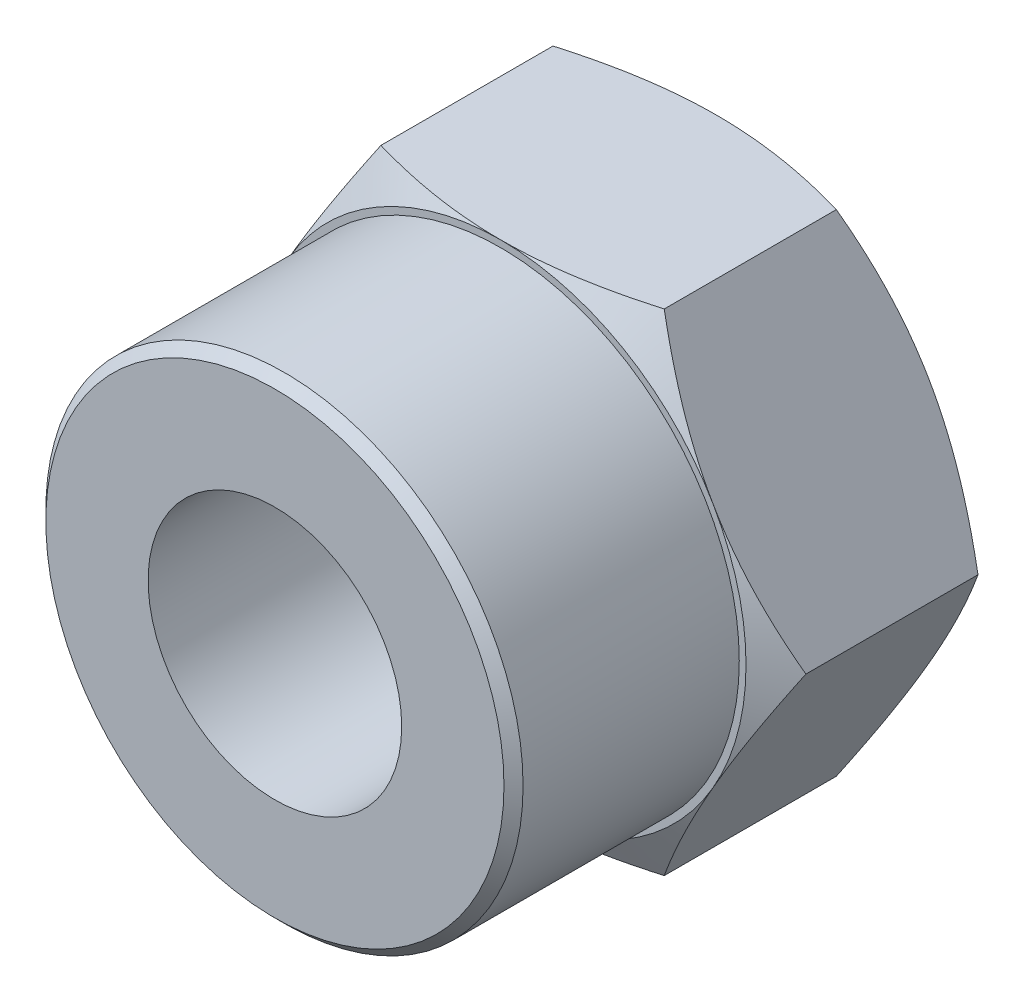
ISO-10303-21;
HEADER;
FILE_DESCRIPTION(('STEP AP214'),'2;1');
FILE_NAME('part.step','',(''),(''),'','','');
FILE_SCHEMA(('AUTOMOTIVE_DESIGN { 1 0 10303 214 1 1 1 1 }'));
ENDSEC;
DATA;
#1=APPLICATION_CONTEXT('core data for automotive mechanical design processes');
#2=APPLICATION_PROTOCOL_DEFINITION('international standard','automotive_design',2000,#1);
#3=PRODUCT_CONTEXT('',#1,'mechanical');
#4=PRODUCT('Part','Part','',(#3));
#5=PRODUCT_RELATED_PRODUCT_CATEGORY('part','',(#4));
#6=PRODUCT_DEFINITION_FORMATION('','',#4);
#7=PRODUCT_DEFINITION_CONTEXT('part definition',#1,'design');
#8=PRODUCT_DEFINITION('design','',#6,#7);
#9=PRODUCT_DEFINITION_SHAPE('','',#8);
#10=(LENGTH_UNIT() NAMED_UNIT(*) SI_UNIT(.MILLI.,.METRE.));
#11=(NAMED_UNIT(*) PLANE_ANGLE_UNIT() SI_UNIT($,.RADIAN.));
#12=(NAMED_UNIT(*) SI_UNIT($,.STERADIAN.) SOLID_ANGLE_UNIT());
#13=UNCERTAINTY_MEASURE_WITH_UNIT(LENGTH_MEASURE(1.E-05),#10,'distance_accuracy_value','');
#14=(GEOMETRIC_REPRESENTATION_CONTEXT(3) GLOBAL_UNCERTAINTY_ASSIGNED_CONTEXT((#13)) GLOBAL_UNIT_ASSIGNED_CONTEXT((#10,
#11,#12)) REPRESENTATION_CONTEXT('',''));
#15=CARTESIAN_POINT('',(0.,0.,0.));
#16=DIRECTION('',(0.,0.,1.));
#17=DIRECTION('',(1.,0.,0.));
#18=AXIS2_PLACEMENT_3D('',#15,#16,#17);
#19=CARTESIAN_POINT('',(6.9282032302755,-3.99999999999999,-3.52));
#20=DIRECTION('',(0.,0.,1.));
#21=DIRECTION('',(1.,0.,0.));
#22=AXIS2_PLACEMENT_3D('',#19,#20,#21);
#23=PLANE('',#22);
#24=CARTESIAN_POINT('',(0.,0.,-3.52));
#25=DIRECTION('',(0.,0.,1.));
#26=DIRECTION('',(1.,0.,0.));
#27=AXIS2_PLACEMENT_3D('',#24,#25,#26);
#28=CIRCLE('',#27,4.);
#29=CARTESIAN_POINT('',(3.46410161513776,2.,-3.52));
#30=VERTEX_POINT('',#29);
#31=CARTESIAN_POINT('',(0.,4.,-3.52));
#32=VERTEX_POINT('',#31);
#33=EDGE_CURVE('E304',#30,#32,#28,.T.);
#34=ORIENTED_EDGE('',*,*,#33,.F.);
#35=CARTESIAN_POINT('',(3.46410161513776,-2.,-3.52));
#36=VERTEX_POINT('',#35);
#37=EDGE_CURVE('E300',#36,#30,#28,.T.);
#38=ORIENTED_EDGE('',*,*,#37,.F.);
#39=CARTESIAN_POINT('',(0.,-4.,-3.52));
#40=VERTEX_POINT('',#39);
#41=EDGE_CURVE('E302',#40,#36,#28,.T.);
#42=ORIENTED_EDGE('',*,*,#41,.F.);
#43=CARTESIAN_POINT('',(-3.46410161513776,-2.,-3.52));
#44=VERTEX_POINT('',#43);
#45=EDGE_CURVE('E388',#44,#40,#28,.T.);
#46=ORIENTED_EDGE('',*,*,#45,.F.);
#47=CARTESIAN_POINT('',(-3.46410161513776,2.,-3.52));
#48=VERTEX_POINT('',#47);
#49=EDGE_CURVE('E389',#48,#44,#28,.T.);
#50=ORIENTED_EDGE('',*,*,#49,.F.);
#51=CARTESIAN_POINT('',(0.,0.,-3.52));
#52=DIRECTION('',(0.,0.,-1.));
#53=DIRECTION('',(-1.,0.,0.));
#54=AXIS2_PLACEMENT_3D('',#51,#52,#53);
#55=CIRCLE('',#54,4.);
#56=EDGE_CURVE('E273',#48,#32,#55,.T.);
#57=ORIENTED_EDGE('',*,*,#56,.T.);
#58=EDGE_LOOP('',(#34,#38,#42,#46,#50,#57));
#59=FACE_BOUND('',#58,.T.);
#60=CARTESIAN_POINT('',(0.,0.,-3.52));
#61=DIRECTION('',(0.,0.,-1.));
#62=DIRECTION('',(-1.,0.,0.));
#63=AXIS2_PLACEMENT_3D('',#60,#61,#62);
#64=CIRCLE('',#63,2.875);
#65=CARTESIAN_POINT('',(-2.875,0.,-3.52));
#66=VERTEX_POINT('',#65);
#67=EDGE_CURVE('E559',#66,#66,#64,.T.);
#68=ORIENTED_EDGE('',*,*,#67,.F.);
#69=EDGE_LOOP('',(#68));
#70=FACE_BOUND('',#69,.T.);
#71=ADVANCED_FACE('F38',(#59,#70),#23,.F.);
#72=CARTESIAN_POINT('',(0.,0.,-3.52));
#73=DIRECTION('',(0.,0.,1.));
#74=DIRECTION('',(1.,0.,0.));
#75=AXIS2_PLACEMENT_3D('',#72,#73,#74);
#76=CYLINDRICAL_SURFACE('',#75,2.067);
#77=CARTESIAN_POINT('',(0.,0.,3.68));
#78=DIRECTION('',(0.,0.,1.));
#79=DIRECTION('',(1.,0.,0.));
#80=AXIS2_PLACEMENT_3D('',#77,#78,#79);
#81=CIRCLE('',#80,2.067);
#82=CARTESIAN_POINT('',(2.067,0.,3.68));
#83=VERTEX_POINT('',#82);
#84=EDGE_CURVE('E556',#83,#83,#81,.T.);
#85=ORIENTED_EDGE('',*,*,#84,.T.);
#86=EDGE_LOOP('',(#85));
#87=FACE_BOUND('',#86,.T.);
#88=CARTESIAN_POINT('',(0.,0.,-3.05350098249479));
#89=DIRECTION('',(0.,0.,-1.));
#90=DIRECTION('',(-1.,0.,0.));
#91=AXIS2_PLACEMENT_3D('',#88,#89,#90);
#92=CIRCLE('',#91,2.067);
#93=CARTESIAN_POINT('',(-2.067,0.,-3.05350098249479));
#94=VERTEX_POINT('',#93);
#95=EDGE_CURVE('E564',#94,#94,#92,.T.);
#96=ORIENTED_EDGE('',*,*,#95,.T.);
#97=EDGE_LOOP('',(#96));
#98=FACE_BOUND('',#97,.T.);
#99=ADVANCED_FACE('F323',(#87,#98),#76,.F.);
#100=CARTESIAN_POINT('',(6.9282032302755,-3.99999999999999,0.));
#101=DIRECTION('',(0.,0.,1.));
#102=DIRECTION('',(1.,0.,0.));
#103=AXIS2_PLACEMENT_3D('',#100,#101,#102);
#104=PLANE('',#103);
#105=CARTESIAN_POINT('',(0.,0.,0.));
#106=DIRECTION('',(0.,0.,1.));
#107=DIRECTION('',(1.,0.,0.));
#108=AXIS2_PLACEMENT_3D('',#105,#106,#107);
#109=CIRCLE('',#108,4.);
#110=CARTESIAN_POINT('',(3.46410161513776,-2.,0.));
#111=VERTEX_POINT('',#110);
#112=CARTESIAN_POINT('',(3.46410161513776,2.,0.));
#113=VERTEX_POINT('',#112);
#114=EDGE_CURVE('E305',#111,#113,#109,.T.);
#115=ORIENTED_EDGE('',*,*,#114,.T.);
#116=CARTESIAN_POINT('',(0.,4.,0.));
#117=VERTEX_POINT('',#116);
#118=EDGE_CURVE('E53',#113,#117,#109,.T.);
#119=ORIENTED_EDGE('',*,*,#118,.T.);
#120=CARTESIAN_POINT('',(0.,0.,0.));
#121=DIRECTION('',(0.,0.,-1.));
#122=DIRECTION('',(-1.,0.,0.));
#123=AXIS2_PLACEMENT_3D('',#120,#121,#122);
#124=CIRCLE('',#123,4.);
#125=CARTESIAN_POINT('',(-3.46410161513776,2.,0.));
#126=VERTEX_POINT('',#125);
#127=EDGE_CURVE('E132',#126,#117,#124,.T.);
#128=ORIENTED_EDGE('',*,*,#127,.F.);
#129=CARTESIAN_POINT('',(-3.46410161513776,-2.,0.));
#130=VERTEX_POINT('',#129);
#131=EDGE_CURVE('E143',#126,#130,#109,.T.);
#132=ORIENTED_EDGE('',*,*,#131,.T.);
#133=CARTESIAN_POINT('',(0.,-4.,0.));
#134=VERTEX_POINT('',#133);
#135=EDGE_CURVE('E151',#130,#134,#109,.T.);
#136=ORIENTED_EDGE('',*,*,#135,.T.);
#137=EDGE_CURVE('E306',#134,#111,#109,.T.);
#138=ORIENTED_EDGE('',*,*,#137,.T.);
#139=EDGE_LOOP('',(#115,#119,#128,#132,#136,#138));
#140=FACE_BOUND('',#139,.T.);
#141=CARTESIAN_POINT('',(0.,0.,5.6843418860808E-11));
#142=DIRECTION('',(0.,0.,1.));
#143=DIRECTION('',(1.,0.,0.));
#144=AXIS2_PLACEMENT_3D('',#141,#142,#143);
#145=CIRCLE('',#144,3.89);
#146=CARTESIAN_POINT('',(3.89,0.,5.6843418860808E-11));
#147=VERTEX_POINT('',#146);
#148=EDGE_CURVE('E157',#147,#147,#145,.T.);
#149=ORIENTED_EDGE('',*,*,#148,.F.);
#150=EDGE_LOOP('',(#149));
#151=FACE_BOUND('',#150,.T.);
#152=ADVANCED_FACE('F154',(#140,#151),#104,.T.);
#153=CARTESIAN_POINT('',(-2.30940107675851,-4.,-3.52));
#154=DIRECTION('',(0.,-1.,0.));
#155=DIRECTION('',(1.,0.,0.));
#156=AXIS2_PLACEMENT_3D('',#153,#154,#155);
#157=PLANE('',#156);
#158=DIRECTION('',(0.,0.,1.));
#159=VECTOR('',#158,1.);
#160=CARTESIAN_POINT('',(2.3094010767585,-4.,-3.52));
#161=LINE('',#160,#159);
#162=CARTESIAN_POINT('',(2.3094010767585,-4.,-3.16273441009184));
#163=VERTEX_POINT('',#162);
#164=CARTESIAN_POINT('',(2.3094010767585,-4.,-0.35726558990815));
#165=VERTEX_POINT('',#164);
#166=EDGE_CURVE('E285',#163,#165,#161,.T.);
#167=ORIENTED_EDGE('',*,*,#166,.T.);
#168=CARTESIAN_POINT('',(-6.12487341769854,-4.,-1.91410751140327));
#169=CARTESIAN_POINT('',(-5.94925074925229,-4.,-1.82923693139934));
#170=CARTESIAN_POINT('',(-5.77321285090695,-4.,-1.74521003492702));
#171=CARTESIAN_POINT('',(-5.42008207974723,-4.,-1.57932571904833));
#172=CARTESIAN_POINT('',(-5.24298903069196,-4.,-1.49746867526278));
#173=CARTESIAN_POINT('',(-4.88656680078543,-4.,-1.33597494722807));
#174=CARTESIAN_POINT('',(-4.70723062291667,-4.,-1.25635364986839));
#175=CARTESIAN_POINT('',(-4.34708428132645,-4.,-1.10053098203766));
#176=CARTESIAN_POINT('',(-4.16627419501903,-4.,-1.0243294333015));
#177=CARTESIAN_POINT('',(-3.80064784913924,-4.,-0.875350961035799));
#178=CARTESIAN_POINT('',(-3.6158096582845,-4.,-0.80262756654455));
#179=CARTESIAN_POINT('',(-3.2439530938769,-4.,-0.662876458232904));
#180=CARTESIAN_POINT('',(-3.05693448038808,-4.,-0.595849378098056));
#181=CARTESIAN_POINT('',(-2.68080364998175,-4.,-0.469291898141035));
#182=CARTESIAN_POINT('',(-2.49169685108729,-4.,-0.409745560405845));
#183=CARTESIAN_POINT('',(-2.11079485187453,-4.,-0.300083438066147));
#184=CARTESIAN_POINT('',(-1.91900052241685,-4.,-0.249964671183517));
#185=CARTESIAN_POINT('',(-1.53259243721996,-4.,-0.161590815968261));
#186=CARTESIAN_POINT('',(-1.3379779447785,-4.,-0.123338888256892));
#187=CARTESIAN_POINT('',(-0.946402576855863,-4.,-0.0612742138769773));
#188=CARTESIAN_POINT('',(-0.749441699301863,-4.,-0.0374614799650943));
#189=CARTESIAN_POINT('',(-0.355451577931481,-4.,-0.00638178961827845));
#190=CARTESIAN_POINT('',(-0.158430812125976,-4.,0.000989914624616259));
#191=CARTESIAN_POINT('',(0.235472757633427,-4.,-0.00120408674876964));
#192=CARTESIAN_POINT('',(0.432355584124876,-4.,-0.0107653957626016));
#193=CARTESIAN_POINT('',(0.768561502729873,-4.,-0.0408788287570003));
#194=CARTESIAN_POINT('',(0.908255510744927,-4.,-0.057509409878042));
#195=CARTESIAN_POINT('',(1.18656443167127,-4.,-0.0982135646467269));
#196=CARTESIAN_POINT('',(1.32517917086071,-4.,-0.122288312133843));
#197=CARTESIAN_POINT('',(1.73929148967676,-4.,-0.204415308856751));
#198=CARTESIAN_POINT('',(2.01284798562146,-4.,-0.272349166850976));
#199=CARTESIAN_POINT('',(2.42218367801555,-4.,-0.389516702639779));
#200=CARTESIAN_POINT('',(2.56009653437116,-4.,-0.431714306251333));
#201=CARTESIAN_POINT('',(2.83448280728091,-4.,-0.520284986292436));
#202=CARTESIAN_POINT('',(2.97095714512845,-4.,-0.566655182759163));
#203=CARTESIAN_POINT('',(3.24189568898015,-4.,-0.662606165964744));
#204=CARTESIAN_POINT('',(3.37636688558452,-4.,-0.712167412243162));
#205=CARTESIAN_POINT('',(3.64426596229283,-4.,-0.814198879097281));
#206=CARTESIAN_POINT('',(3.77769339550538,-4.,-0.866670275382286));
#207=CARTESIAN_POINT('',(3.91063838536393,-4.,-0.920309569779419));
#208=B_SPLINE_CURVE_WITH_KNOTS('',3,(#168,#169,#170,#171,#172,#173,#174,#175,#176,#177,#178,
#179,#180,#181,#182,#183,#184,#185,#186,#187,#188,#189,#190,#191,#192,#193,#194,#195,#196,#197,
#198,#199,#200,#201,#202,#203,#204,#205,#206,#207),.UNSPECIFIED.,.F.,.F.,(4,2,2,2,2,2,2,2,2,2,2,
2,2,2,2,2,2,2,2,4),(0.,0.585171963095448,1.17044457175392,1.75906646017955,2.34765762911911,
2.94347487147064,3.53935830888688,4.13394985840929,4.72835299985961,5.32291431936071,
5.91747616414096,6.50823902912393,7.09884852691628,7.52068391959198,7.94258586367792,
8.78701766848812,9.21965565808348,9.65199729435849,10.0819054210591,10.5119885153525),.UNSPECIFIED.);
#209=EDGE_CURVE('E61',#165,#134,#208,.F.);
#210=ORIENTED_EDGE('',*,*,#209,.T.);
#211=CARTESIAN_POINT('',(-2.30940107675851,-4.,-0.357265589908153));
#212=VERTEX_POINT('',#211);
#213=EDGE_CURVE('E267',#134,#212,#208,.F.);
#214=ORIENTED_EDGE('',*,*,#213,.T.);
#215=DIRECTION('',(0.,0.,1.));
#216=VECTOR('',#215,1.);
#217=CARTESIAN_POINT('',(-2.30940107675851,-4.,-3.52));
#218=LINE('',#217,#216);
#219=CARTESIAN_POINT('',(-2.30940107675851,-3.99999999999999,-3.16273441009184));
#220=VERTEX_POINT('',#219);
#221=EDGE_CURVE('E303',#220,#212,#218,.T.);
#222=ORIENTED_EDGE('',*,*,#221,.F.);
#223=CARTESIAN_POINT('',(-6.12487341769854,-4.,-1.60589248859671));
#224=CARTESIAN_POINT('',(-5.94925074925229,-4.,-1.69076306860064));
#225=CARTESIAN_POINT('',(-5.77321285090695,-4.,-1.77478996507296));
#226=CARTESIAN_POINT('',(-5.42008207974723,-4.,-1.94067428095165));
#227=CARTESIAN_POINT('',(-5.24298903069196,-4.,-2.0225313247372));
#228=CARTESIAN_POINT('',(-4.88656680078543,-4.,-2.18402505277192));
#229=CARTESIAN_POINT('',(-4.70723062291667,-4.,-2.2636463501316));
#230=CARTESIAN_POINT('',(-4.34708428132645,-4.,-2.41946901796233));
#231=CARTESIAN_POINT('',(-4.16627419501903,-4.,-2.49567056669849));
#232=CARTESIAN_POINT('',(-3.80064784913923,-4.,-2.64464903896419));
#233=CARTESIAN_POINT('',(-3.61580965828449,-4.,-2.71737243345544));
#234=CARTESIAN_POINT('',(-3.2439530938769,-4.,-2.85712354176709));
#235=CARTESIAN_POINT('',(-3.05693448038808,-4.,-2.92415062190194));
#236=CARTESIAN_POINT('',(-2.68080364998175,-4.,-3.05070810185896));
#237=CARTESIAN_POINT('',(-2.49169685108728,-4.,-3.11025443959415));
#238=CARTESIAN_POINT('',(-2.11079485187453,-4.,-3.21991656193385));
#239=CARTESIAN_POINT('',(-1.91900052241685,-4.,-3.27003532881648));
#240=CARTESIAN_POINT('',(-1.53259243721996,-4.,-3.35840918403174));
#241=CARTESIAN_POINT('',(-1.3379779447785,-4.,-3.39666111174311));
#242=CARTESIAN_POINT('',(-0.946402576855864,-4.,-3.45872578612302));
#243=CARTESIAN_POINT('',(-0.749441699301864,-4.,-3.4825385200349));
#244=CARTESIAN_POINT('',(-0.35545157793148,-4.,-3.51361821038172));
#245=CARTESIAN_POINT('',(-0.158430812125974,-4.,-3.52098991462462));
#246=CARTESIAN_POINT('',(0.235472757633429,-4.,-3.51879591325123));
#247=CARTESIAN_POINT('',(0.432355584124879,-4.,-3.5092346042374));
#248=CARTESIAN_POINT('',(0.768561502729875,-4.,-3.479121171243));
#249=CARTESIAN_POINT('',(0.908255510744927,-4.,-3.46249059012196));
#250=CARTESIAN_POINT('',(1.18656443167127,-4.,-3.42178643535327));
#251=CARTESIAN_POINT('',(1.32517917086071,-4.,-3.39771168786615));
#252=CARTESIAN_POINT('',(1.73929148967675,-4.,-3.31558469114325));
#253=CARTESIAN_POINT('',(2.01284798562145,-4.,-3.24765083314902));
#254=CARTESIAN_POINT('',(2.42218367801553,-4.,-3.13048329736022));
#255=CARTESIAN_POINT('',(2.56009653437114,-4.,-3.08828569374867));
#256=CARTESIAN_POINT('',(2.83448280728089,-4.,-2.99971501370756));
#257=CARTESIAN_POINT('',(2.97095714512843,-4.,-2.95334481724084));
#258=CARTESIAN_POINT('',(3.24189568898012,-4.,-2.85739383403526));
#259=CARTESIAN_POINT('',(3.3763668855845,-4.,-2.80783258775684));
#260=CARTESIAN_POINT('',(3.6442659622928,-4.,-2.70580112090272));
#261=CARTESIAN_POINT('',(3.77769339550534,-4.,-2.65332972461772));
#262=CARTESIAN_POINT('',(3.91063838536389,-4.,-2.59969043022058));
#263=B_SPLINE_CURVE_WITH_KNOTS('',3,(#223,#224,#225,#226,#227,#228,#229,#230,#231,#232,#233,
#234,#235,#236,#237,#238,#239,#240,#241,#242,#243,#244,#245,#246,#247,#248,#249,#250,#251,#252,
#253,#254,#255,#256,#257,#258,#259,#260,#261,#262),.UNSPECIFIED.,.F.,.F.,(4,2,2,2,2,2,2,2,2,2,2,
2,2,2,2,2,2,2,2,4),(0.,0.585171963095449,1.17044457175392,1.75906646017955,2.34765762911911,
2.94347487147064,3.53935830888689,4.1339498584093,4.72835299985962,5.32291431936072,
5.91747616414097,6.50823902912394,7.09884852691628,7.52068391959198,7.94258586367792,
8.78701766848811,9.21965565808347,9.65199729435847,10.0819054210591,10.5119885153525),.UNSPECIFIED.);
#264=EDGE_CURVE('E254',#220,#40,#263,.T.);
#265=ORIENTED_EDGE('',*,*,#264,.T.);
#266=EDGE_CURVE('E239',#40,#163,#263,.T.);
#267=ORIENTED_EDGE('',*,*,#266,.T.);
#268=EDGE_LOOP('',(#167,#210,#214,#222,#265,#267));
#269=FACE_BOUND('',#268,.T.);
#270=ADVANCED_FACE('F261',(#269),#157,.T.);
#271=CARTESIAN_POINT('',(-4.61880215351701,0.,-3.52));
#272=DIRECTION('',(-0.866025403784438,-0.5,0.));
#273=DIRECTION('',(0.5,-0.866025403784438,0.));
#274=AXIS2_PLACEMENT_3D('',#271,#272,#273);
#275=PLANE('',#274);
#276=ORIENTED_EDGE('',*,*,#221,.T.);
#277=CARTESIAN_POINT('',(-2.30928560670467,-4.0002,-0.357332259074757));
#278=CARTESIAN_POINT('',(-2.41077174646171,-3.82442084967677,-0.298717873648274));
#279=CARTESIAN_POINT('',(-2.513133908835,-3.64712438367362,-0.245410321462256));
#280=CARTESIAN_POINT('',(-2.71963072479812,-3.28946140682429,-0.152361670746399));
#281=CARTESIAN_POINT('',(-2.82376904741904,-3.10908854102985,-0.112653489029701));
#282=CARTESIAN_POINT('',(-3.03075510011795,-2.75057818129721,-0.0508422152802777));
#283=CARTESIAN_POINT('',(-3.13357098372492,-2.57249584706486,-0.0283277315228881));
#284=CARTESIAN_POINT('',(-3.33968651028528,-2.21549328283349,-0.00145062314658182));
#285=CARTESIAN_POINT('',(-3.44298540411434,-2.0365743503559,0.00293425857305661));
#286=CARTESIAN_POINT('',(-3.63600352522932,-1.70225715780327,-0.00619007293997026));
#287=CARTESIAN_POINT('',(-3.72575165335065,-1.54680884001294,-0.017458953987994));
#288=CARTESIAN_POINT('',(-3.90466320392055,-1.23692494436495,-0.053173990798192));
#289=CARTESIAN_POINT('',(-3.99382600759479,-1.08249043825587,-0.0776323457115312));
#290=CARTESIAN_POINT('',(-4.17310641015197,-0.771967672225423,-0.138776064919286));
#291=CARTESIAN_POINT('',(-4.26320131938131,-0.615918711936898,-0.17572060365486));
#292=CARTESIAN_POINT('',(-4.44204742827551,-0.30614816459616,-0.259570072548022));
#293=CARTESIAN_POINT('',(-4.53080091904967,-0.152422609226219,-0.306455302212734));
#294=CARTESIAN_POINT('',(-4.61891762357085,0.000200000000001805,-0.35733225907476));
#295=B_SPLINE_CURVE_WITH_KNOTS('',3,(#277,#278,#279,#280,#281,#282,#283,#284,#285,#286,#287,
#288,#289,#290,#291,#292,#293,#294),.UNSPECIFIED.,.F.,.F.,(4,2,2,2,2,2,2,2,4),(0.,
0.634047835695963,1.26961969224543,1.88946157213121,2.50854226669296,3.04757825393385,
3.58711366126903,4.13861653143763,4.68903648037743),.UNSPECIFIED.);
#296=EDGE_CURVE('E164',#212,#130,#295,.T.);
#297=ORIENTED_EDGE('',*,*,#296,.T.);
#298=CARTESIAN_POINT('',(-4.61880215351701,0.,-0.357265589908153));
#299=VERTEX_POINT('',#298);
#300=EDGE_CURVE('E146',#130,#299,#295,.T.);
#301=ORIENTED_EDGE('',*,*,#300,.T.);
#302=DIRECTION('',(0.,0.,1.));
#303=VECTOR('',#302,1.);
#304=CARTESIAN_POINT('',(-4.61880215351701,0.,-3.52));
#305=LINE('',#304,#303);
#306=CARTESIAN_POINT('',(-4.618802153517,0.,-3.16273441009184));
#307=VERTEX_POINT('',#306);
#308=EDGE_CURVE('E163',#307,#299,#305,.T.);
#309=ORIENTED_EDGE('',*,*,#308,.F.);
#310=CARTESIAN_POINT('',(-4.61891762357085,0.000200000000001885,-3.16266774092524));
#311=CARTESIAN_POINT('',(-4.51743148381381,-0.175579150323226,-3.22128212635172));
#312=CARTESIAN_POINT('',(-4.41506932144052,-0.352875616326379,-3.27458967853774));
#313=CARTESIAN_POINT('',(-4.2085725054774,-0.710538593175704,-3.3676383292536));
#314=CARTESIAN_POINT('',(-4.10443418285647,-0.890911458970149,-3.40734651097029));
#315=CARTESIAN_POINT('',(-3.89744813015756,-1.24942181870279,-3.46915778471972));
#316=CARTESIAN_POINT('',(-3.7946322465506,-1.42750415293514,-3.49167226847711));
#317=CARTESIAN_POINT('',(-3.58851671999023,-1.78450671716651,-3.51854937685342));
#318=CARTESIAN_POINT('',(-3.48521782616117,-1.9634256496441,-3.52293425857306));
#319=CARTESIAN_POINT('',(-3.29219970504619,-2.29774284219673,-3.51380992706003));
#320=CARTESIAN_POINT('',(-3.20245157692487,-2.45319115998706,-3.50254104601201));
#321=CARTESIAN_POINT('',(-3.02354002635497,-2.76307505563505,-3.46682600920181));
#322=CARTESIAN_POINT('',(-2.93437722268073,-2.91750956174413,-3.44236765428847));
#323=CARTESIAN_POINT('',(-2.75509682012354,-3.22803232777458,-3.38122393508071));
#324=CARTESIAN_POINT('',(-2.6650019108942,-3.3840812880631,-3.34427939634514));
#325=CARTESIAN_POINT('',(-2.48615580200001,-3.69385183540384,-3.26042992745198));
#326=CARTESIAN_POINT('',(-2.39740231122585,-3.84757739077378,-3.21354469778726));
#327=CARTESIAN_POINT('',(-2.30928560670467,-4.0002,-3.16266774092524));
#328=B_SPLINE_CURVE_WITH_KNOTS('',3,(#310,#311,#312,#313,#314,#315,#316,#317,#318,#319,#320,
#321,#322,#323,#324,#325,#326,#327),.UNSPECIFIED.,.F.,.F.,(4,2,2,2,2,2,2,2,4),(0.,
0.634047835695965,1.26961969224543,1.88946157213122,2.50854226669297,3.04757825393386,
3.58711366126903,4.13861653143764,4.68903648037743),.UNSPECIFIED.);
#329=EDGE_CURVE('E342',#307,#44,#328,.T.);
#330=ORIENTED_EDGE('',*,*,#329,.T.);
#331=EDGE_CURVE('E336',#44,#220,#328,.T.);
#332=ORIENTED_EDGE('',*,*,#331,.T.);
#333=EDGE_LOOP('',(#276,#297,#301,#309,#330,#332));
#334=FACE_BOUND('',#333,.T.);
#335=ADVANCED_FACE('F264',(#334),#275,.T.);
#336=CARTESIAN_POINT('',(-2.30940107675851,4.,-3.52));
#337=DIRECTION('',(-0.866025403784438,0.5,0.));
#338=DIRECTION('',(-0.5,-0.866025403784439,0.));
#339=AXIS2_PLACEMENT_3D('',#336,#337,#338);
#340=PLANE('',#339);
#341=ORIENTED_EDGE('',*,*,#308,.T.);
#342=CARTESIAN_POINT('',(-4.61891762357085,-0.000199999999998168,-0.35733225907476));
#343=CARTESIAN_POINT('',(-4.51743148381381,0.175579150323229,-0.298717873648277));
#344=CARTESIAN_POINT('',(-4.41506932144052,0.352875616326382,-0.245410321462259));
#345=CARTESIAN_POINT('',(-4.2085725054774,0.710538593175707,-0.152361670746402));
#346=CARTESIAN_POINT('',(-4.10443418285647,0.890911458970151,-0.112653489029704));
#347=CARTESIAN_POINT('',(-3.89744813015757,1.24942181870279,-0.0508422152802801));
#348=CARTESIAN_POINT('',(-3.7946322465506,1.42750415293514,-0.0283277315228906));
#349=CARTESIAN_POINT('',(-3.58851671999023,1.78450671716651,-0.00145062314658385));
#350=CARTESIAN_POINT('',(-3.48521782616118,1.9634256496441,0.00293425857305516));
#351=CARTESIAN_POINT('',(-3.29219970504619,2.29774284219673,-0.00619007293997122));
#352=CARTESIAN_POINT('',(-3.20245157692487,2.45319115998707,-0.017458953987995));
#353=CARTESIAN_POINT('',(-3.02354002635497,2.76307505563506,-0.0531739907981928));
#354=CARTESIAN_POINT('',(-2.93437722268073,2.91750956174413,-0.0776323457115318));
#355=CARTESIAN_POINT('',(-2.75509682012355,3.22803232777458,-0.138776064919286));
#356=CARTESIAN_POINT('',(-2.6650019108942,3.3840812880631,-0.175720603654859));
#357=CARTESIAN_POINT('',(-2.48615580200001,3.69385183540384,-0.259570072548021));
#358=CARTESIAN_POINT('',(-2.39740231122585,3.84757739077378,-0.306455302212733));
#359=CARTESIAN_POINT('',(-2.30928560670467,4.0002,-0.357332259074758));
#360=B_SPLINE_CURVE_WITH_KNOTS('',3,(#342,#343,#344,#345,#346,#347,#348,#349,#350,#351,#352,
#353,#354,#355,#356,#357,#358,#359),.UNSPECIFIED.,.F.,.F.,(4,2,2,2,2,2,2,2,4),(0.,
0.634047835695964,1.26961969224543,1.88946157213122,2.50854226669297,3.04757825393385,
3.58711366126903,4.13861653143763,4.68903648037743),.UNSPECIFIED.);
#361=EDGE_CURVE('E139',#299,#126,#360,.T.);
#362=ORIENTED_EDGE('',*,*,#361,.T.);
#363=CARTESIAN_POINT('',(-2.3094010767585,4.,-0.357265589908153));
#364=VERTEX_POINT('',#363);
#365=EDGE_CURVE('E128',#126,#364,#360,.T.);
#366=ORIENTED_EDGE('',*,*,#365,.T.);
#367=DIRECTION('',(0.,0.,1.));
#368=VECTOR('',#367,1.);
#369=CARTESIAN_POINT('',(-2.30940107675851,4.,-3.52));
#370=LINE('',#369,#368);
#371=CARTESIAN_POINT('',(-2.30940107675849,4.,-3.16273441009184));
#372=VERTEX_POINT('',#371);
#373=EDGE_CURVE('E351',#372,#364,#370,.T.);
#374=ORIENTED_EDGE('',*,*,#373,.F.);
#375=CARTESIAN_POINT('',(-2.30928560670467,4.0002,-3.16266774092524));
#376=CARTESIAN_POINT('',(-2.41077174646171,3.82442084967677,-3.22128212635172));
#377=CARTESIAN_POINT('',(-2.513133908835,3.64712438367362,-3.27458967853774));
#378=CARTESIAN_POINT('',(-2.71963072479812,3.2894614068243,-3.3676383292536));
#379=CARTESIAN_POINT('',(-2.82376904741905,3.10908854102985,-3.40734651097029));
#380=CARTESIAN_POINT('',(-3.03075510011795,2.75057818129721,-3.46915778471972));
#381=CARTESIAN_POINT('',(-3.13357098372492,2.57249584706486,-3.49167226847711));
#382=CARTESIAN_POINT('',(-3.33968651028529,2.21549328283349,-3.51854937685342));
#383=CARTESIAN_POINT('',(-3.44298540411434,2.0365743503559,-3.52293425857305));
#384=CARTESIAN_POINT('',(-3.63600352522933,1.70225715780327,-3.51380992706003));
#385=CARTESIAN_POINT('',(-3.72575165335065,1.54680884001294,-3.502541046012));
#386=CARTESIAN_POINT('',(-3.90466320392055,1.23692494436495,-3.4668260092018));
#387=CARTESIAN_POINT('',(-3.99382600759479,1.08249043825587,-3.44236765428847));
#388=CARTESIAN_POINT('',(-4.17310641015198,0.771967672225425,-3.38122393508071));
#389=CARTESIAN_POINT('',(-4.26320131938132,0.615918711936901,-3.34427939634514));
#390=CARTESIAN_POINT('',(-4.44204742827551,0.306148164596163,-3.26042992745197));
#391=CARTESIAN_POINT('',(-4.53080091904967,0.152422609226223,-3.21354469778726));
#392=CARTESIAN_POINT('',(-4.61891762357085,-0.000199999999997913,-3.16266774092524));
#393=B_SPLINE_CURVE_WITH_KNOTS('',3,(#375,#376,#377,#378,#379,#380,#381,#382,#383,#384,#385,
#386,#387,#388,#389,#390,#391,#392),.UNSPECIFIED.,.F.,.F.,(4,2,2,2,2,2,2,2,4),(0.,
0.634047835695965,1.26961969224543,1.88946157213122,2.50854226669297,3.04757825393386,
3.58711366126903,4.13861653143763,4.68903648037743),.UNSPECIFIED.);
#394=EDGE_CURVE('E290',#372,#48,#393,.T.);
#395=ORIENTED_EDGE('',*,*,#394,.T.);
#396=EDGE_CURVE('E296',#48,#307,#393,.T.);
#397=ORIENTED_EDGE('',*,*,#396,.T.);
#398=EDGE_LOOP('',(#341,#362,#366,#374,#395,#397));
#399=FACE_BOUND('',#398,.T.);
#400=ADVANCED_FACE('F160',(#399),#340,.T.);
#401=CARTESIAN_POINT('',(2.3094010767585,4.,-3.52));
#402=DIRECTION('',(0.,1.,0.));
#403=DIRECTION('',(-1.,0.,0.));
#404=AXIS2_PLACEMENT_3D('',#401,#402,#403);
#405=PLANE('',#404);
#406=ORIENTED_EDGE('',*,*,#373,.T.);
#407=CARTESIAN_POINT('',(-6.12487198995892,4.,-1.91410682124058));
#408=CARTESIAN_POINT('',(-5.94924937038677,4.,-1.82923627076684));
#409=CARTESIAN_POINT('',(-5.77321152095286,4.,-1.74520940380735));
#410=CARTESIAN_POINT('',(-5.42008084777955,4.,-1.57932514679712));
#411=CARTESIAN_POINT('',(-5.24298784779928,4.,-1.49746813236719));
#412=CARTESIAN_POINT('',(-4.88656571686334,4.,-1.33597446305852));
#413=CARTESIAN_POINT('',(-4.70722958889362,4.,-1.256353195063));
#414=CARTESIAN_POINT('',(-4.34708334747263,4.,-1.10053058542026));
#415=CARTESIAN_POINT('',(-4.16627331143537,4.,-1.02432906550799));
#416=CARTESIAN_POINT('',(-3.80064706744977,4.,-0.875350650394334));
#417=CARTESIAN_POINT('',(-3.6158089282277,4.,-0.80262728421582));
#418=CARTESIAN_POINT('',(-3.24395246794968,4.,-0.662876230959399));
#419=CARTESIAN_POINT('',(-3.05693390695801,4.,-0.595849177566486));
#420=CARTESIAN_POINT('',(-2.6808031825377,4.,-0.469291748430867));
#421=CARTESIAN_POINT('',(-2.49169643712849,4.,-0.409745434783825));
#422=CARTESIAN_POINT('',(-2.11079454635851,4.,-0.300083356544497));
#423=CARTESIAN_POINT('',(-1.91900027185749,4.,-0.249964609676745));
#424=CARTESIAN_POINT('',(-1.532592326982,4.,-0.161590794954038));
#425=CARTESIAN_POINT('',(-1.3379779203165,4.,-0.123338885956537));
#426=CARTESIAN_POINT('',(-0.946402725872557,4.,-0.0612742359223425));
#427=CARTESIAN_POINT('',(-0.749441936019778,4.,-0.0374615076516985));
#428=CARTESIAN_POINT('',(-0.355451989627948,4.,-0.00638181314943677));
#429=CARTESIAN_POINT('',(-0.158431311094017,4.,0.000989900761040556));
#430=CARTESIAN_POINT('',(0.235472085607461,4.,-0.00120406637479616));
#431=CARTESIAN_POINT('',(0.432354826312197,4.,-0.0107653508153508));
#432=CARTESIAN_POINT('',(0.768560635225514,4.,-0.0408787346135901));
#433=CARTESIAN_POINT('',(0.908254618381822,4.,-0.0575092960439094));
#434=CARTESIAN_POINT('',(1.18656349063498,4.,-0.098213410346692));
#435=CARTESIAN_POINT('',(1.32517820601015,4.,-0.122288137058447));
#436=CARTESIAN_POINT('',(1.73929045452973,4.,-0.204415070950233));
#437=CARTESIAN_POINT('',(2.01284690528726,4.,-0.272348886425158));
#438=CARTESIAN_POINT('',(2.4221825301453,4.,-0.389516359317211));
#439=CARTESIAN_POINT('',(2.56009536361545,4.,-0.431713941811644));
#440=CARTESIAN_POINT('',(2.83448159101411,4.,-0.520284580227773));
#441=CARTESIAN_POINT('',(2.97095590623565,4.,-0.566654756186924));
#442=CARTESIAN_POINT('',(3.2418944051635,4.,-0.662605699180301));
#443=CARTESIAN_POINT('',(3.37636557946848,4.,-0.712166925753516));
#444=CARTESIAN_POINT('',(3.64426461152925,4.,-0.81419835379072));
#445=CARTESIAN_POINT('',(3.77769202239398,4.,-0.866669730963389));
#446=CARTESIAN_POINT('',(3.91063698986696,4.,-0.920309006541813));
#447=B_SPLINE_CURVE_WITH_KNOTS('',3,(#407,#408,#409,#410,#411,#412,#413,#414,#415,#416,#417,
#418,#419,#420,#421,#422,#423,#424,#425,#426,#427,#428,#429,#430,#431,#432,#433,#434,#435,#436,
#437,#438,#439,#440,#441,#442,#443,#444,#445,#446),.UNSPECIFIED.,.F.,.F.,(4,2,2,2,2,2,2,2,2,2,2,
2,2,2,2,2,2,2,2,4),(0.,0.585171792532269,1.17044423059926,1.75906594645989,2.34765694284826,
2.94347400997483,3.53935727210688,4.13394864697599,4.72835161391469,5.32291267067843,
5.91747425310811,6.50823685854034,7.09884609659884,7.5206814082552,7.9425832713084,
8.78701491359833,9.21965281897694,9.65199437116305,10.0819024146298,10.5119854255248),.UNSPECIFIED.);
#448=EDGE_CURVE('E134',#364,#117,#447,.T.);
#449=ORIENTED_EDGE('',*,*,#448,.T.);
#450=CARTESIAN_POINT('',(2.3094010767585,4.,-0.357265589908153));
#451=VERTEX_POINT('',#450);
#452=EDGE_CURVE('E173',#117,#451,#447,.T.);
#453=ORIENTED_EDGE('',*,*,#452,.T.);
#454=DIRECTION('',(0.,0.,1.));
#455=VECTOR('',#454,1.);
#456=CARTESIAN_POINT('',(2.3094010767585,4.,-3.52));
#457=LINE('',#456,#455);
#458=CARTESIAN_POINT('',(2.3094010767585,4.,-3.16273441009184));
#459=VERTEX_POINT('',#458);
#460=EDGE_CURVE('E293',#459,#451,#457,.T.);
#461=ORIENTED_EDGE('',*,*,#460,.F.);
#462=CARTESIAN_POINT('',(-6.12487198995892,4.,-1.6058931787594));
#463=CARTESIAN_POINT('',(-5.94924937038676,4.,-1.69076372923314));
#464=CARTESIAN_POINT('',(-5.77321152095286,4.,-1.77479059619264));
#465=CARTESIAN_POINT('',(-5.42008084777955,4.,-1.94067485320287));
#466=CARTESIAN_POINT('',(-5.24298784779928,4.,-2.0225318676328));
#467=CARTESIAN_POINT('',(-4.88656571686334,4.,-2.18402553694147));
#468=CARTESIAN_POINT('',(-4.70722958889362,4.,-2.26364680493699));
#469=CARTESIAN_POINT('',(-4.34708334747263,4.,-2.41946941457972));
#470=CARTESIAN_POINT('',(-4.16627331143537,4.,-2.495670934492));
#471=CARTESIAN_POINT('',(-3.80064706744977,4.,-2.64464934960566));
#472=CARTESIAN_POINT('',(-3.6158089282277,4.,-2.71737271578417));
#473=CARTESIAN_POINT('',(-3.24395246794968,4.,-2.85712376904059));
#474=CARTESIAN_POINT('',(-3.05693390695801,4.,-2.92415082243351));
#475=CARTESIAN_POINT('',(-2.6808031825377,4.,-3.05070825156913));
#476=CARTESIAN_POINT('',(-2.49169643712848,4.,-3.11025456521617));
#477=CARTESIAN_POINT('',(-2.11079454635851,4.,-3.2199166434555));
#478=CARTESIAN_POINT('',(-1.91900027185749,4.,-3.27003539032325));
#479=CARTESIAN_POINT('',(-1.532592326982,4.,-3.35840920504596));
#480=CARTESIAN_POINT('',(-1.3379779203165,4.,-3.39666111404346));
#481=CARTESIAN_POINT('',(-0.946402725872556,4.,-3.45872576407766));
#482=CARTESIAN_POINT('',(-0.749441936019776,4.,-3.4825384923483));
#483=CARTESIAN_POINT('',(-0.355451989627946,4.,-3.51361818685056));
#484=CARTESIAN_POINT('',(-0.158431311094015,4.,-3.52098990076104));
#485=CARTESIAN_POINT('',(0.235472085607464,4.,-3.5187959336252));
#486=CARTESIAN_POINT('',(0.4323548263122,4.,-3.50923464918465));
#487=CARTESIAN_POINT('',(0.768560635225514,4.,-3.47912126538641));
#488=CARTESIAN_POINT('',(0.90825461838182,4.,-3.46249070395609));
#489=CARTESIAN_POINT('',(1.18656349063498,4.,-3.42178658965331));
#490=CARTESIAN_POINT('',(1.32517820601014,4.,-3.39771186294155));
#491=CARTESIAN_POINT('',(1.73929045452971,4.,-3.31558492904977));
#492=CARTESIAN_POINT('',(2.01284690528725,4.,-3.24765111357484));
#493=CARTESIAN_POINT('',(2.42218253014528,4.,-3.13048364068279));
#494=CARTESIAN_POINT('',(2.56009536361543,4.,-3.08828605818836));
#495=CARTESIAN_POINT('',(2.83448159101409,4.,-2.99971541977223));
#496=CARTESIAN_POINT('',(2.97095590623563,4.,-2.95334524381308));
#497=CARTESIAN_POINT('',(3.24189440516347,4.,-2.8573943008197));
#498=CARTESIAN_POINT('',(3.37636557946844,4.,-2.80783307424649));
#499=CARTESIAN_POINT('',(3.64426461152921,4.,-2.70580164620928));
#500=CARTESIAN_POINT('',(3.77769202239395,4.,-2.65333026903662));
#501=CARTESIAN_POINT('',(3.91063698986692,4.,-2.59969099345819));
#502=B_SPLINE_CURVE_WITH_KNOTS('',3,(#462,#463,#464,#465,#466,#467,#468,#469,#470,#471,#472,
#473,#474,#475,#476,#477,#478,#479,#480,#481,#482,#483,#484,#485,#486,#487,#488,#489,#490,#491,
#492,#493,#494,#495,#496,#497,#498,#499,#500,#501),.UNSPECIFIED.,.F.,.F.,(4,2,2,2,2,2,2,2,2,2,2,
2,2,2,2,2,2,2,2,4),(0.,0.58517179253227,1.17044423059927,1.75906594645989,2.34765694284826,
2.94347400997483,3.53935727210688,4.13394864697599,4.7283516139147,5.32291267067844,
5.91747425310811,6.50823685854035,7.09884609659885,7.52068140825521,7.9425832713084,
8.78701491359832,9.21965281897693,9.65199437116302,10.0819024146298,10.5119854255248),.UNSPECIFIED.);
#503=EDGE_CURVE('E255',#459,#32,#502,.F.);
#504=ORIENTED_EDGE('',*,*,#503,.T.);
#505=EDGE_CURVE('E348',#32,#372,#502,.F.);
#506=ORIENTED_EDGE('',*,*,#505,.T.);
#507=EDGE_LOOP('',(#406,#449,#453,#461,#504,#506));
#508=FACE_BOUND('',#507,.T.);
#509=ADVANCED_FACE('F225',(#508),#405,.T.);
#510=CARTESIAN_POINT('',(4.618802153517,0.,-3.52));
#511=DIRECTION('',(0.866025403784438,0.5,0.));
#512=DIRECTION('',(-0.5,0.866025403784439,0.));
#513=AXIS2_PLACEMENT_3D('',#510,#511,#512);
#514=PLANE('',#513);
#515=ORIENTED_EDGE('',*,*,#460,.T.);
#516=CARTESIAN_POINT('',(2.30928560670466,4.0002,-0.357332259074757));
#517=CARTESIAN_POINT('',(2.4107717464617,3.82442084967678,-0.298717873648274));
#518=CARTESIAN_POINT('',(2.51313390883499,3.64712438367362,-0.245410321462255));
#519=CARTESIAN_POINT('',(2.71963072479811,3.2894614068243,-0.152361670746399));
#520=CARTESIAN_POINT('',(2.82376904741904,3.10908854102985,-0.1126534890297));
#521=CARTESIAN_POINT('',(3.03075510011794,2.75057818129722,-0.0508422152802762));
#522=CARTESIAN_POINT('',(3.13357098372491,2.57249584706486,-0.0283277315228861));
#523=CARTESIAN_POINT('',(3.33968651028528,2.2154932828335,-0.0014506231465793));
#524=CARTESIAN_POINT('',(3.44298540411433,2.03657435035591,0.00293425857305923));
#525=CARTESIAN_POINT('',(3.63600352522931,1.70225715780328,-0.006190072939967));
#526=CARTESIAN_POINT('',(3.72575165335064,1.54680884001294,-0.0174589539879903));
#527=CARTESIAN_POINT('',(3.90466320392054,1.23692494436495,-0.053173990798188));
#528=CARTESIAN_POINT('',(3.99382600759478,1.08249043825588,-0.0776323457115272));
#529=CARTESIAN_POINT('',(4.17310641015197,0.771967672225427,-0.138776064919282));
#530=CARTESIAN_POINT('',(4.26320131938131,0.615918711936902,-0.175720603654855));
#531=CARTESIAN_POINT('',(4.4420474282755,0.306148164596163,-0.259570072548017));
#532=CARTESIAN_POINT('',(4.53080091904966,0.152422609226223,-0.306455302212729));
#533=CARTESIAN_POINT('',(4.61891762357084,-0.000199999999998005,-0.357332259074755));
#534=B_SPLINE_CURVE_WITH_KNOTS('',3,(#516,#517,#518,#519,#520,#521,#522,#523,#524,#525,#526,
#527,#528,#529,#530,#531,#532,#533),.UNSPECIFIED.,.F.,.F.,(4,2,2,2,2,2,2,2,4),(0.,
0.634047835695964,1.26961969224543,1.88946157213121,2.50854226669296,3.04757825393385,
3.58711366126903,4.13861653143764,4.68903648037743),.UNSPECIFIED.);
#535=EDGE_CURVE('E219',#451,#113,#534,.T.);
#536=ORIENTED_EDGE('',*,*,#535,.T.);
#537=CARTESIAN_POINT('',(4.61880215351701,0.,-0.357265589908153));
#538=VERTEX_POINT('',#537);
#539=EDGE_CURVE('E211',#113,#538,#534,.T.);
#540=ORIENTED_EDGE('',*,*,#539,.T.);
#541=DIRECTION('',(0.,0.,1.));
#542=VECTOR('',#541,1.);
#543=CARTESIAN_POINT('',(4.618802153517,0.,-3.52));
#544=LINE('',#543,#542);
#545=CARTESIAN_POINT('',(4.618802153517,0.,-3.16273441009184));
#546=VERTEX_POINT('',#545);
#547=EDGE_CURVE('E289',#546,#538,#544,.T.);
#548=ORIENTED_EDGE('',*,*,#547,.F.);
#549=CARTESIAN_POINT('',(4.61891762357084,-0.000199999999997857,-3.16266774092524));
#550=CARTESIAN_POINT('',(4.5174314838138,0.17557915032323,-3.22128212635172));
#551=CARTESIAN_POINT('',(4.41506932144051,0.352875616326382,-3.27458967853774));
#552=CARTESIAN_POINT('',(4.20857250547739,0.710538593175707,-3.3676383292536));
#553=CARTESIAN_POINT('',(4.10443418285646,0.890911458970151,-3.4073465109703));
#554=CARTESIAN_POINT('',(3.89744813015756,1.24942181870279,-3.46915778471972));
#555=CARTESIAN_POINT('',(3.79463224655059,1.42750415293514,-3.49167226847711));
#556=CARTESIAN_POINT('',(3.58851671999023,1.78450671716651,-3.51854937685342));
#557=CARTESIAN_POINT('',(3.48521782616117,1.9634256496441,-3.52293425857306));
#558=CARTESIAN_POINT('',(3.29219970504619,2.29774284219673,-3.51380992706003));
#559=CARTESIAN_POINT('',(3.20245157692486,2.45319115998706,-3.50254104601201));
#560=CARTESIAN_POINT('',(3.02354002635496,2.76307505563505,-3.46682600920181));
#561=CARTESIAN_POINT('',(2.93437722268072,2.91750956174413,-3.44236765428847));
#562=CARTESIAN_POINT('',(2.75509682012354,3.22803232777458,-3.38122393508071));
#563=CARTESIAN_POINT('',(2.6650019108942,3.3840812880631,-3.34427939634514));
#564=CARTESIAN_POINT('',(2.486155802,3.69385183540384,-3.26042992745198));
#565=CARTESIAN_POINT('',(2.39740231122584,3.84757739077378,-3.21354469778726));
#566=CARTESIAN_POINT('',(2.30928560670466,4.0002,-3.16266774092524));
#567=B_SPLINE_CURVE_WITH_KNOTS('',3,(#549,#550,#551,#552,#553,#554,#555,#556,#557,#558,#559,
#560,#561,#562,#563,#564,#565,#566),.UNSPECIFIED.,.F.,.F.,(4,2,2,2,2,2,2,2,4),(0.,
0.634047835695964,1.26961969224543,1.88946157213122,2.50854226669296,3.04757825393385,
3.58711366126903,4.13861653143764,4.68903648037743),.UNSPECIFIED.);
#568=EDGE_CURVE('E231',#546,#30,#567,.T.);
#569=ORIENTED_EDGE('',*,*,#568,.T.);
#570=EDGE_CURVE('E241',#30,#459,#567,.T.);
#571=ORIENTED_EDGE('',*,*,#570,.T.);
#572=EDGE_LOOP('',(#515,#536,#540,#548,#569,#571));
#573=FACE_BOUND('',#572,.T.);
#574=ADVANCED_FACE('F221',(#573),#514,.T.);
#575=CARTESIAN_POINT('',(2.3094010767585,-4.,-3.52));
#576=DIRECTION('',(0.866025403784439,-0.5,0.));
#577=DIRECTION('',(0.5,0.866025403784439,0.));
#578=AXIS2_PLACEMENT_3D('',#575,#576,#577);
#579=PLANE('',#578);
#580=ORIENTED_EDGE('',*,*,#547,.T.);
#581=CARTESIAN_POINT('',(4.61891762357084,0.000200000000002152,-0.357332259074755));
#582=CARTESIAN_POINT('',(4.5174314838138,-0.175579150323226,-0.298717873648272));
#583=CARTESIAN_POINT('',(4.41506932144051,-0.352875616326378,-0.245410321462254));
#584=CARTESIAN_POINT('',(4.20857250547739,-0.710538593175702,-0.152361670746397));
#585=CARTESIAN_POINT('',(4.10443418285647,-0.890911458970146,-0.112653489029699));
#586=CARTESIAN_POINT('',(3.89744813015756,-1.24942181870278,-0.0508422152802749));
#587=CARTESIAN_POINT('',(3.79463224655059,-1.42750415293514,-0.028327731522885));
#588=CARTESIAN_POINT('',(3.58851671999023,-1.7845067171665,-0.00145062314657833));
#589=CARTESIAN_POINT('',(3.48521782616117,-1.96342564964409,0.00293425857306032));
#590=CARTESIAN_POINT('',(3.29219970504619,-2.29774284219672,-0.00619007293996605));
#591=CARTESIAN_POINT('',(3.20245157692486,-2.45319115998706,-0.0174589539879896));
#592=CARTESIAN_POINT('',(3.02354002635497,-2.76307505563505,-0.0531739907981874));
#593=CARTESIAN_POINT('',(2.93437722268073,-2.91750956174412,-0.0776323457115267));
#594=CARTESIAN_POINT('',(2.75509682012354,-3.22803232777457,-0.138776064919281));
#595=CARTESIAN_POINT('',(2.6650019108942,-3.3840812880631,-0.175720603654854));
#596=CARTESIAN_POINT('',(2.486155802,-3.69385183540383,-0.259570072548016));
#597=CARTESIAN_POINT('',(2.39740231122584,-3.84757739077377,-0.306455302212728));
#598=CARTESIAN_POINT('',(2.30928560670466,-4.0002,-0.357332259074754));
#599=B_SPLINE_CURVE_WITH_KNOTS('',3,(#581,#582,#583,#584,#585,#586,#587,#588,#589,#590,#591,
#592,#593,#594,#595,#596,#597,#598),.UNSPECIFIED.,.F.,.F.,(4,2,2,2,2,2,2,2,4),(0.,
0.634047835695964,1.26961969224543,1.88946157213121,2.50854226669296,3.04757825393385,
3.58711366126903,4.13861653143763,4.68903648037743),.UNSPECIFIED.);
#600=EDGE_CURVE('E220',#538,#111,#599,.T.);
#601=ORIENTED_EDGE('',*,*,#600,.T.);
#602=EDGE_CURVE('E156',#111,#165,#599,.T.);
#603=ORIENTED_EDGE('',*,*,#602,.T.);
#604=ORIENTED_EDGE('',*,*,#166,.F.);
#605=CARTESIAN_POINT('',(2.30928560670466,-4.0002,-3.16266774092524));
#606=CARTESIAN_POINT('',(2.4107717464617,-3.82442084967677,-3.22128212635172));
#607=CARTESIAN_POINT('',(2.51313390883499,-3.64712438367362,-3.27458967853774));
#608=CARTESIAN_POINT('',(2.71963072479811,-3.28946140682429,-3.3676383292536));
#609=CARTESIAN_POINT('',(2.82376904741904,-3.10908854102985,-3.4073465109703));
#610=CARTESIAN_POINT('',(3.03075510011795,-2.75057818129721,-3.46915778471972));
#611=CARTESIAN_POINT('',(3.13357098372491,-2.57249584706486,-3.49167226847711));
#612=CARTESIAN_POINT('',(3.33968651028528,-2.21549328283349,-3.51854937685342));
#613=CARTESIAN_POINT('',(3.44298540411434,-2.0365743503559,-3.52293425857306));
#614=CARTESIAN_POINT('',(3.63600352522932,-1.70225715780327,-3.51380992706003));
#615=CARTESIAN_POINT('',(3.72575165335064,-1.54680884001294,-3.50254104601201));
#616=CARTESIAN_POINT('',(3.90466320392054,-1.23692494436495,-3.46682600920181));
#617=CARTESIAN_POINT('',(3.99382600759478,-1.08249043825587,-3.44236765428847));
#618=CARTESIAN_POINT('',(4.17310641015197,-0.771967672225422,-3.38122393508071));
#619=CARTESIAN_POINT('',(4.26320131938131,-0.615918711936897,-3.34427939634514));
#620=CARTESIAN_POINT('',(4.4420474282755,-0.306148164596159,-3.26042992745198));
#621=CARTESIAN_POINT('',(4.53080091904966,-0.152422609226219,-3.21354469778727));
#622=CARTESIAN_POINT('',(4.61891762357084,0.000200000000002153,-3.16266774092524));
#623=B_SPLINE_CURVE_WITH_KNOTS('',3,(#605,#606,#607,#608,#609,#610,#611,#612,#613,#614,#615,
#616,#617,#618,#619,#620,#621,#622),.UNSPECIFIED.,.F.,.F.,(4,2,2,2,2,2,2,2,4),(0.,
0.634047835695965,1.26961969224543,1.88946157213122,2.50854226669296,3.04757825393385,
3.58711366126903,4.13861653143763,4.68903648037743),.UNSPECIFIED.);
#624=EDGE_CURVE('E240',#163,#36,#623,.T.);
#625=ORIENTED_EDGE('',*,*,#624,.T.);
#626=EDGE_CURVE('E242',#36,#546,#623,.T.);
#627=ORIENTED_EDGE('',*,*,#626,.T.);
#628=EDGE_LOOP('',(#580,#601,#603,#604,#625,#627));
#629=FACE_BOUND('',#628,.T.);
#630=ADVANCED_FACE('F224',(#629),#579,.T.);
#631=CARTESIAN_POINT('',(0.,0.,-3.52));
#632=DIRECTION('',(0.,0.,1.));
#633=DIRECTION('',(1.,0.,0.));
#634=AXIS2_PLACEMENT_3D('',#631,#632,#633);
#635=CONICAL_SURFACE('',#634,4.,1.04719755119661);
#636=ORIENTED_EDGE('',*,*,#626,.F.);
#637=ORIENTED_EDGE('',*,*,#37,.T.);
#638=ORIENTED_EDGE('',*,*,#568,.F.);
#639=EDGE_LOOP('',(#636,#637,#638));
#640=FACE_BOUND('',#639,.T.);
#641=ADVANCED_FACE('F198',(#640),#635,.T.);
#642=ORIENTED_EDGE('',*,*,#41,.T.);
#643=ORIENTED_EDGE('',*,*,#624,.F.);
#644=ORIENTED_EDGE('',*,*,#266,.F.);
#645=EDGE_LOOP('',(#642,#643,#644));
#646=FACE_BOUND('',#645,.T.);
#647=ADVANCED_FACE('F384',(#646),#635,.T.);
#648=ORIENTED_EDGE('',*,*,#45,.T.);
#649=ORIENTED_EDGE('',*,*,#264,.F.);
#650=ORIENTED_EDGE('',*,*,#331,.F.);
#651=EDGE_LOOP('',(#648,#649,#650));
#652=FACE_BOUND('',#651,.T.);
#653=ADVANCED_FACE('F395',(#652),#635,.T.);
#654=ORIENTED_EDGE('',*,*,#49,.T.);
#655=ORIENTED_EDGE('',*,*,#329,.F.);
#656=ORIENTED_EDGE('',*,*,#396,.F.);
#657=EDGE_LOOP('',(#654,#655,#656));
#658=FACE_BOUND('',#657,.T.);
#659=ADVANCED_FACE('F400',(#658),#635,.T.);
#660=ORIENTED_EDGE('',*,*,#505,.F.);
#661=ORIENTED_EDGE('',*,*,#56,.F.);
#662=ORIENTED_EDGE('',*,*,#394,.F.);
#663=EDGE_LOOP('',(#660,#661,#662));
#664=FACE_BOUND('',#663,.T.);
#665=ADVANCED_FACE('F398',(#664),#635,.T.);
#666=ORIENTED_EDGE('',*,*,#570,.F.);
#667=ORIENTED_EDGE('',*,*,#33,.T.);
#668=ORIENTED_EDGE('',*,*,#503,.F.);
#669=EDGE_LOOP('',(#666,#667,#668));
#670=FACE_BOUND('',#669,.T.);
#671=ADVANCED_FACE('F193',(#670),#635,.T.);
#672=CARTESIAN_POINT('',(0.,0.,-0.357265589908153));
#673=DIRECTION('',(0.,0.,-1.));
#674=DIRECTION('',(-1.,0.,0.));
#675=AXIS2_PLACEMENT_3D('',#672,#673,#674);
#676=CONICAL_SURFACE('',#675,4.61880215351701,1.04719755119661);
#677=ORIENTED_EDGE('',*,*,#114,.F.);
#678=ORIENTED_EDGE('',*,*,#600,.F.);
#679=ORIENTED_EDGE('',*,*,#539,.F.);
#680=EDGE_LOOP('',(#677,#678,#679));
#681=FACE_BOUND('',#680,.T.);
#682=ADVANCED_FACE('F187',(#681),#676,.T.);
#683=ORIENTED_EDGE('',*,*,#602,.F.);
#684=ORIENTED_EDGE('',*,*,#137,.F.);
#685=ORIENTED_EDGE('',*,*,#209,.F.);
#686=EDGE_LOOP('',(#683,#684,#685));
#687=FACE_BOUND('',#686,.T.);
#688=ADVANCED_FACE('F192',(#687),#676,.T.);
#689=ORIENTED_EDGE('',*,*,#135,.F.);
#690=ORIENTED_EDGE('',*,*,#296,.F.);
#691=ORIENTED_EDGE('',*,*,#213,.F.);
#692=EDGE_LOOP('',(#689,#690,#691));
#693=FACE_BOUND('',#692,.T.);
#694=ADVANCED_FACE('F368',(#693),#676,.T.);
#695=ORIENTED_EDGE('',*,*,#131,.F.);
#696=ORIENTED_EDGE('',*,*,#361,.F.);
#697=ORIENTED_EDGE('',*,*,#300,.F.);
#698=EDGE_LOOP('',(#695,#696,#697));
#699=FACE_BOUND('',#698,.T.);
#700=ADVANCED_FACE('F144',(#699),#676,.T.);
#701=ORIENTED_EDGE('',*,*,#127,.T.);
#702=ORIENTED_EDGE('',*,*,#448,.F.);
#703=ORIENTED_EDGE('',*,*,#365,.F.);
#704=EDGE_LOOP('',(#701,#702,#703));
#705=FACE_BOUND('',#704,.T.);
#706=ADVANCED_FACE('F130',(#705),#676,.T.);
#707=ORIENTED_EDGE('',*,*,#118,.F.);
#708=ORIENTED_EDGE('',*,*,#535,.F.);
#709=ORIENTED_EDGE('',*,*,#452,.F.);
#710=EDGE_LOOP('',(#707,#708,#709));
#711=FACE_BOUND('',#710,.T.);
#712=ADVANCED_FACE('F195',(#711),#676,.T.);
#713=CARTESIAN_POINT('',(0.,0.,21.8825815152627));
#714=DIRECTION('',(0.,0.,-1.));
#715=DIRECTION('',(-1.,0.,0.));
#716=AXIS2_PLACEMENT_3D('',#713,#714,#715);
#717=CYLINDRICAL_SURFACE('',#716,3.89);
#718=CARTESIAN_POINT('',(0.,0.,3.5244));
#719=DIRECTION('',(0.,0.,1.));
#720=DIRECTION('',(1.,0.,0.));
#721=AXIS2_PLACEMENT_3D('',#718,#719,#720);
#722=CIRCLE('',#721,3.89);
#723=CARTESIAN_POINT('',(3.89,0.,3.5244));
#724=VERTEX_POINT('',#723);
#725=EDGE_CURVE('E12',#724,#724,#722,.F.);
#726=ORIENTED_EDGE('',*,*,#725,.T.);
#727=EDGE_LOOP('',(#726));
#728=FACE_BOUND('',#727,.T.);
#729=ORIENTED_EDGE('',*,*,#148,.T.);
#730=EDGE_LOOP('',(#729));
#731=FACE_BOUND('',#730,.T.);
#732=ADVANCED_FACE('F196',(#728,#731),#717,.T.);
#733=CARTESIAN_POINT('',(6.9282032302755,-3.99999999999999,3.68));
#734=DIRECTION('',(0.,0.,1.));
#735=DIRECTION('',(1.,0.,0.));
#736=AXIS2_PLACEMENT_3D('',#733,#734,#735);
#737=PLANE('',#736);
#738=CARTESIAN_POINT('',(0.,0.,3.68));
#739=DIRECTION('',(0.,0.,1.));
#740=DIRECTION('',(1.,0.,0.));
#741=AXIS2_PLACEMENT_3D('',#738,#739,#740);
#742=CIRCLE('',#741,3.7344);
#743=CARTESIAN_POINT('',(3.7344,0.,3.68));
#744=VERTEX_POINT('',#743);
#745=EDGE_CURVE('E46',#744,#744,#742,.T.);
#746=ORIENTED_EDGE('',*,*,#745,.T.);
#747=EDGE_LOOP('',(#746));
#748=FACE_BOUND('',#747,.T.);
#749=ORIENTED_EDGE('',*,*,#84,.F.);
#750=EDGE_LOOP('',(#749));
#751=FACE_BOUND('',#750,.T.);
#752=ADVANCED_FACE('F310',(#748,#751),#737,.T.);
#753=CARTESIAN_POINT('',(0.,0.,-3.05350098249479));
#754=DIRECTION('',(0.,0.,-1.));
#755=DIRECTION('',(-1.,0.,0.));
#756=AXIS2_PLACEMENT_3D('',#753,#754,#755);
#757=CONICAL_SURFACE('',#756,2.067,1.0471975511966);
#758=ORIENTED_EDGE('',*,*,#67,.T.);
#759=EDGE_LOOP('',(#758));
#760=FACE_BOUND('',#759,.T.);
#761=ORIENTED_EDGE('',*,*,#95,.F.);
#762=EDGE_LOOP('',(#761));
#763=FACE_BOUND('',#762,.T.);
#764=ADVANCED_FACE('F314',(#760,#763),#757,.F.);
#765=CARTESIAN_POINT('',(0.,0.,3.68));
#766=DIRECTION('',(0.,0.,-1.));
#767=DIRECTION('',(-1.,0.,0.));
#768=AXIS2_PLACEMENT_3D('',#765,#766,#767);
#769=CONICAL_SURFACE('',#768,3.7344,0.785398163397454);
#770=ORIENTED_EDGE('',*,*,#725,.F.);
#771=EDGE_LOOP('',(#770));
#772=FACE_BOUND('',#771,.T.);
#773=ORIENTED_EDGE('',*,*,#745,.F.);
#774=EDGE_LOOP('',(#773));
#775=FACE_BOUND('',#774,.T.);
#776=ADVANCED_FACE('F40',(#772,#775),#769,.T.);
#777=CLOSED_SHELL('',(#71,#99,#152,#270,#335,#400,#509,#574,#630,#641,#647,#653,#659,#665,#671,
#682,#688,#694,#700,#706,#712,#732,#752,#764,#776));
#778=MANIFOLD_SOLID_BREP('B2',#777);
#779=ADVANCED_BREP_SHAPE_REPRESENTATION('',(#18,#778),#14);
#780=SHAPE_DEFINITION_REPRESENTATION(#9,#779);
ENDSEC;
END-ISO-10303-21;
